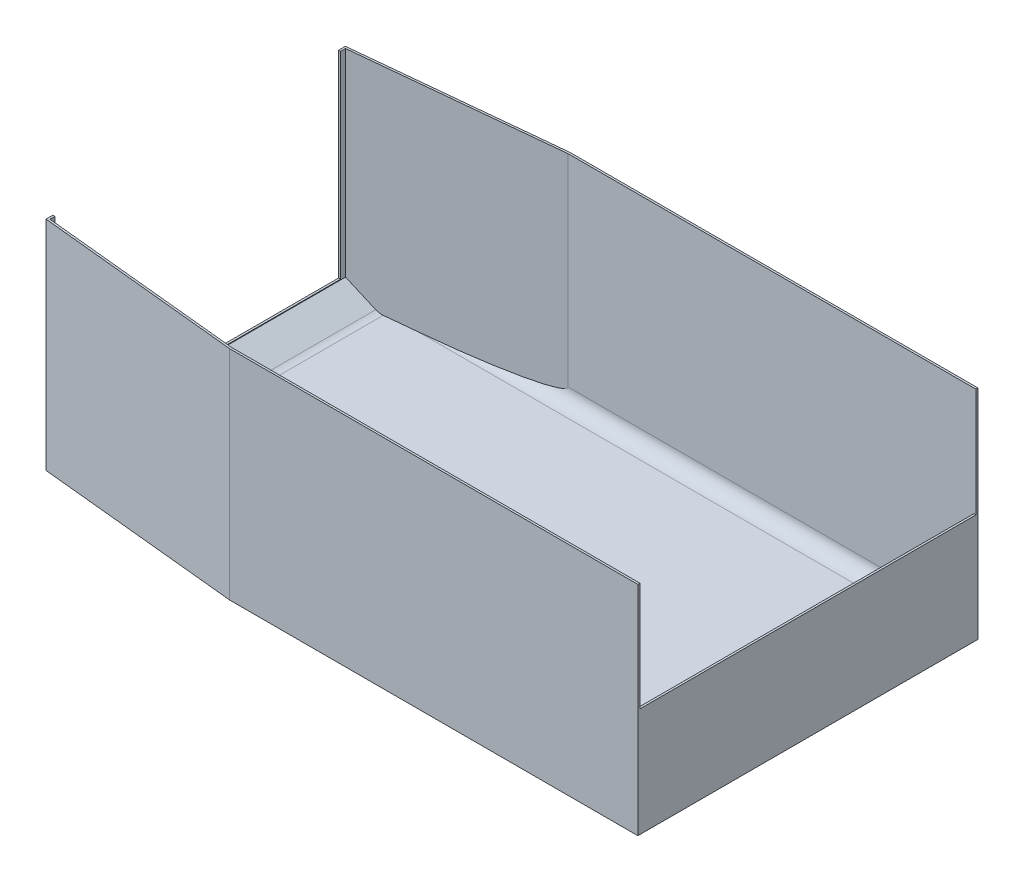
ISO-10303-21;
HEADER;
FILE_DESCRIPTION(('STEP AP214'),'2;1');
FILE_NAME('part.step','',(''),(''),'','','');
FILE_SCHEMA(('AUTOMOTIVE_DESIGN { 1 0 10303 214 1 1 1 1 }'));
ENDSEC;
DATA;
#1=APPLICATION_CONTEXT('core data for automotive mechanical design processes');
#2=APPLICATION_PROTOCOL_DEFINITION('international standard','automotive_design',2000,#1);
#3=PRODUCT_CONTEXT('',#1,'mechanical');
#4=PRODUCT('Part','Part','',(#3));
#5=PRODUCT_RELATED_PRODUCT_CATEGORY('part','',(#4));
#6=PRODUCT_DEFINITION_FORMATION('','',#4);
#7=PRODUCT_DEFINITION_CONTEXT('part definition',#1,'design');
#8=PRODUCT_DEFINITION('design','',#6,#7);
#9=PRODUCT_DEFINITION_SHAPE('','',#8);
#10=(LENGTH_UNIT() NAMED_UNIT(*) SI_UNIT(.MILLI.,.METRE.));
#11=(NAMED_UNIT(*) PLANE_ANGLE_UNIT() SI_UNIT($,.RADIAN.));
#12=(NAMED_UNIT(*) SI_UNIT($,.STERADIAN.) SOLID_ANGLE_UNIT());
#13=UNCERTAINTY_MEASURE_WITH_UNIT(LENGTH_MEASURE(1.E-05),#10,'distance_accuracy_value','');
#14=(GEOMETRIC_REPRESENTATION_CONTEXT(3) GLOBAL_UNCERTAINTY_ASSIGNED_CONTEXT((#13)) GLOBAL_UNIT_ASSIGNED_CONTEXT((#10,
#11,#12)) REPRESENTATION_CONTEXT('',''));
#15=CARTESIAN_POINT('',(0.,0.,0.));
#16=DIRECTION('',(0.,0.,1.));
#17=DIRECTION('',(1.,0.,0.));
#18=AXIS2_PLACEMENT_3D('',#15,#16,#17);
#19=CARTESIAN_POINT('',(0.,160.,0.));
#20=DIRECTION('',(0.,1.,0.));
#21=DIRECTION('',(0.,0.,1.));
#22=AXIS2_PLACEMENT_3D('',#19,#20,#21);
#23=PLANE('',#22);
#24=DIRECTION('',(0.,0.,-1.));
#25=VECTOR('',#24,1.);
#26=CARTESIAN_POINT('',(150.,160.,-125.));
#27=LINE('',#26,#25);
#28=CARTESIAN_POINT('',(150.,160.,125.));
#29=VERTEX_POINT('',#28);
#30=CARTESIAN_POINT('',(150.,160.,123.5));
#31=VERTEX_POINT('',#30);
#32=EDGE_CURVE('E272',#29,#31,#27,.T.);
#33=ORIENTED_EDGE('',*,*,#32,.T.);
#34=DIRECTION('',(1.,0.,0.));
#35=VECTOR('',#34,1.);
#36=CARTESIAN_POINT('',(-150.,160.,123.5));
#37=LINE('',#36,#35);
#38=CARTESIAN_POINT('',(-149.925186568319,160.,123.5));
#39=VERTEX_POINT('',#38);
#40=EDGE_CURVE('E206',#39,#31,#37,.T.);
#41=ORIENTED_EDGE('',*,*,#40,.F.);
#42=DIRECTION('',(0.995037190209989,0.,0.0995037190209985));
#43=VECTOR('',#42,1.);
#44=CARTESIAN_POINT('',(-299.850744421468,160.,108.507444214685));
#45=LINE('',#44,#43);
#46=CARTESIAN_POINT('',(-298.5,160.,108.642518656832));
#47=VERTEX_POINT('',#46);
#48=EDGE_CURVE('E268',#47,#39,#45,.T.);
#49=ORIENTED_EDGE('',*,*,#48,.F.);
#50=DIRECTION('',(0.,0.,1.));
#51=VECTOR('',#50,1.);
#52=CARTESIAN_POINT('',(-298.5,160.,110.));
#53=LINE('',#52,#51);
#54=CARTESIAN_POINT('',(-298.5,160.,105.));
#55=VERTEX_POINT('',#54);
#56=EDGE_CURVE('E264',#55,#47,#53,.T.);
#57=ORIENTED_EDGE('',*,*,#56,.F.);
#58=DIRECTION('',(1.,0.,0.));
#59=VECTOR('',#58,1.);
#60=CARTESIAN_POINT('',(0.,160.,105.));
#61=LINE('',#60,#59);
#62=CARTESIAN_POINT('',(-300.,160.,105.));
#63=VERTEX_POINT('',#62);
#64=EDGE_CURVE('E229',#63,#55,#61,.T.);
#65=ORIENTED_EDGE('',*,*,#64,.F.);
#66=DIRECTION('',(0.,0.,1.));
#67=VECTOR('',#66,1.);
#68=CARTESIAN_POINT('',(-300.,160.,110.));
#69=LINE('',#68,#67);
#70=CARTESIAN_POINT('',(-300.,160.,110.));
#71=VERTEX_POINT('',#70);
#72=EDGE_CURVE('E279',#63,#71,#69,.T.);
#73=ORIENTED_EDGE('',*,*,#72,.T.);
#74=DIRECTION('',(0.995037190209989,0.,0.0995037190209984));
#75=VECTOR('',#74,1.);
#76=CARTESIAN_POINT('',(-300.,160.,110.));
#77=LINE('',#76,#75);
#78=CARTESIAN_POINT('',(-150.,160.,125.));
#79=VERTEX_POINT('',#78);
#80=EDGE_CURVE('E283',#71,#79,#77,.T.);
#81=ORIENTED_EDGE('',*,*,#80,.T.);
#82=DIRECTION('',(1.,0.,0.));
#83=VECTOR('',#82,1.);
#84=CARTESIAN_POINT('',(-150.,160.,125.));
#85=LINE('',#84,#83);
#86=EDGE_CURVE('E285',#79,#29,#85,.T.);
#87=ORIENTED_EDGE('',*,*,#86,.T.);
#88=EDGE_LOOP('',(#33,#41,#49,#57,#65,#73,#81,#87));
#89=FACE_BOUND('',#88,.T.);
#90=ADVANCED_FACE('F43',(#89),#23,.T.);
#91=CARTESIAN_POINT('',(150.,160.,-125.));
#92=DIRECTION('',(-1.,0.,0.));
#93=DIRECTION('',(0.,0.,1.));
#94=AXIS2_PLACEMENT_3D('',#91,#92,#93);
#95=PLANE('',#94);
#96=DIRECTION('',(0.,0.,-1.));
#97=VECTOR('',#96,1.);
#98=CARTESIAN_POINT('',(150.,80.,123.5));
#99=LINE('',#98,#97);
#100=CARTESIAN_POINT('',(150.,80.,123.5));
#101=VERTEX_POINT('',#100);
#102=CARTESIAN_POINT('',(150.,80.,-123.5));
#103=VERTEX_POINT('',#102);
#104=EDGE_CURVE('E195',#101,#103,#99,.T.);
#105=ORIENTED_EDGE('',*,*,#104,.F.);
#106=DIRECTION('',(0.,-1.,0.));
#107=VECTOR('',#106,1.);
#108=CARTESIAN_POINT('',(150.,160.,123.5));
#109=LINE('',#108,#107);
#110=EDGE_CURVE('E203',#31,#101,#109,.T.);
#111=ORIENTED_EDGE('',*,*,#110,.F.);
#112=ORIENTED_EDGE('',*,*,#32,.F.);
#113=DIRECTION('',(0.,-1.,0.));
#114=VECTOR('',#113,1.);
#115=CARTESIAN_POINT('',(150.,160.,125.));
#116=LINE('',#115,#114);
#117=CARTESIAN_POINT('',(150.,0.,125.));
#118=VERTEX_POINT('',#117);
#119=EDGE_CURVE('E287',#29,#118,#116,.T.);
#120=ORIENTED_EDGE('',*,*,#119,.T.);
#121=DIRECTION('',(0.,0.,-1.));
#122=VECTOR('',#121,1.);
#123=CARTESIAN_POINT('',(150.,0.,-125.));
#124=LINE('',#123,#122);
#125=CARTESIAN_POINT('',(150.,0.,-125.));
#126=VERTEX_POINT('',#125);
#127=EDGE_CURVE('E242',#118,#126,#124,.T.);
#128=ORIENTED_EDGE('',*,*,#127,.T.);
#129=DIRECTION('',(0.,-1.,0.));
#130=VECTOR('',#129,1.);
#131=CARTESIAN_POINT('',(150.,160.,-125.));
#132=LINE('',#131,#130);
#133=CARTESIAN_POINT('',(150.,160.,-125.));
#134=VERTEX_POINT('',#133);
#135=EDGE_CURVE('E314',#134,#126,#132,.T.);
#136=ORIENTED_EDGE('',*,*,#135,.F.);
#137=CARTESIAN_POINT('',(150.,160.,-123.5));
#138=VERTEX_POINT('',#137);
#139=EDGE_CURVE('E275',#138,#134,#27,.T.);
#140=ORIENTED_EDGE('',*,*,#139,.F.);
#141=DIRECTION('',(0.,1.,0.));
#142=VECTOR('',#141,1.);
#143=CARTESIAN_POINT('',(150.,160.,-123.5));
#144=LINE('',#143,#142);
#145=EDGE_CURVE('E200',#103,#138,#144,.T.);
#146=ORIENTED_EDGE('',*,*,#145,.F.);
#147=EDGE_LOOP('',(#105,#111,#112,#120,#128,#136,#140,#146));
#148=FACE_BOUND('',#147,.T.);
#149=ADVANCED_FACE('F211',(#148),#95,.F.);
#150=CARTESIAN_POINT('',(-150.,160.,-125.));
#151=DIRECTION('',(0.,0.,1.));
#152=DIRECTION('',(1.,0.,0.));
#153=AXIS2_PLACEMENT_3D('',#150,#151,#152);
#154=PLANE('',#153);
#155=DIRECTION('',(-1.,0.,0.));
#156=VECTOR('',#155,1.);
#157=CARTESIAN_POINT('',(-150.,0.,-125.));
#158=LINE('',#157,#156);
#159=CARTESIAN_POINT('',(-150.,0.,-125.));
#160=VERTEX_POINT('',#159);
#161=EDGE_CURVE('E290',#126,#160,#158,.T.);
#162=ORIENTED_EDGE('',*,*,#161,.T.);
#163=DIRECTION('',(0.,-1.,0.));
#164=VECTOR('',#163,1.);
#165=CARTESIAN_POINT('',(-150.,160.,-125.));
#166=LINE('',#165,#164);
#167=CARTESIAN_POINT('',(-150.,160.,-125.));
#168=VERTEX_POINT('',#167);
#169=EDGE_CURVE('E311',#168,#160,#166,.T.);
#170=ORIENTED_EDGE('',*,*,#169,.F.);
#171=DIRECTION('',(-1.,0.,0.));
#172=VECTOR('',#171,1.);
#173=CARTESIAN_POINT('',(-150.,160.,-125.));
#174=LINE('',#173,#172);
#175=EDGE_CURVE('E274',#134,#168,#174,.T.);
#176=ORIENTED_EDGE('',*,*,#175,.F.);
#177=ORIENTED_EDGE('',*,*,#135,.T.);
#178=EDGE_LOOP('',(#162,#170,#176,#177));
#179=FACE_BOUND('',#178,.T.);
#180=ADVANCED_FACE('F406',(#179),#154,.F.);
#181=CARTESIAN_POINT('',(-300.,160.,-110.));
#182=DIRECTION('',(0.0995037190209992,0.,0.995037190209989));
#183=DIRECTION('',(0.995037190209989,0.,-0.0995037190209992));
#184=AXIS2_PLACEMENT_3D('',#181,#182,#183);
#185=PLANE('',#184);
#186=DIRECTION('',(-0.995037190209989,0.,0.0995037190209992));
#187=VECTOR('',#186,1.);
#188=CARTESIAN_POINT('',(-300.,0.,-110.));
#189=LINE('',#188,#187);
#190=CARTESIAN_POINT('',(-300.,0.,-110.));
#191=VERTEX_POINT('',#190);
#192=EDGE_CURVE('E292',#160,#191,#189,.T.);
#193=ORIENTED_EDGE('',*,*,#192,.T.);
#194=DIRECTION('',(0.,-1.,0.));
#195=VECTOR('',#194,1.);
#196=CARTESIAN_POINT('',(-300.,160.,-110.));
#197=LINE('',#196,#195);
#198=CARTESIAN_POINT('',(-300.,160.,-110.));
#199=VERTEX_POINT('',#198);
#200=EDGE_CURVE('E308',#199,#191,#197,.T.);
#201=ORIENTED_EDGE('',*,*,#200,.F.);
#202=DIRECTION('',(-0.995037190209989,0.,0.0995037190209992));
#203=VECTOR('',#202,1.);
#204=CARTESIAN_POINT('',(-300.,160.,-110.));
#205=LINE('',#204,#203);
#206=EDGE_CURVE('E277',#168,#199,#205,.T.);
#207=ORIENTED_EDGE('',*,*,#206,.F.);
#208=ORIENTED_EDGE('',*,*,#169,.T.);
#209=EDGE_LOOP('',(#193,#201,#207,#208));
#210=FACE_BOUND('',#209,.T.);
#211=ADVANCED_FACE('F431',(#210),#185,.F.);
#212=CARTESIAN_POINT('',(-300.,160.,110.));
#213=DIRECTION('',(1.,0.,0.));
#214=DIRECTION('',(0.,0.,-1.));
#215=AXIS2_PLACEMENT_3D('',#212,#213,#214);
#216=PLANE('',#215);
#217=DIRECTION('',(0.,0.,1.));
#218=VECTOR('',#217,1.);
#219=CARTESIAN_POINT('',(-300.,15.,-105.));
#220=LINE('',#219,#218);
#221=CARTESIAN_POINT('',(-300.,15.,-105.));
#222=VERTEX_POINT('',#221);
#223=CARTESIAN_POINT('',(-300.,15.,105.));
#224=VERTEX_POINT('',#223);
#225=EDGE_CURVE('E221',#222,#224,#220,.T.);
#226=ORIENTED_EDGE('',*,*,#225,.F.);
#227=DIRECTION('',(0.,-1.,0.));
#228=VECTOR('',#227,1.);
#229=CARTESIAN_POINT('',(-300.,200.,-105.));
#230=LINE('',#229,#228);
#231=CARTESIAN_POINT('',(-300.,160.,-105.));
#232=VERTEX_POINT('',#231);
#233=EDGE_CURVE('E219',#232,#222,#230,.T.);
#234=ORIENTED_EDGE('',*,*,#233,.F.);
#235=EDGE_CURVE('E280',#199,#232,#69,.T.);
#236=ORIENTED_EDGE('',*,*,#235,.F.);
#237=ORIENTED_EDGE('',*,*,#200,.T.);
#238=DIRECTION('',(0.,0.,1.));
#239=VECTOR('',#238,1.);
#240=CARTESIAN_POINT('',(-300.,0.,110.));
#241=LINE('',#240,#239);
#242=CARTESIAN_POINT('',(-300.,0.,110.));
#243=VERTEX_POINT('',#242);
#244=EDGE_CURVE('E294',#191,#243,#241,.T.);
#245=ORIENTED_EDGE('',*,*,#244,.T.);
#246=DIRECTION('',(0.,-1.,0.));
#247=VECTOR('',#246,1.);
#248=CARTESIAN_POINT('',(-300.,160.,110.));
#249=LINE('',#248,#247);
#250=EDGE_CURVE('E305',#71,#243,#249,.T.);
#251=ORIENTED_EDGE('',*,*,#250,.F.);
#252=ORIENTED_EDGE('',*,*,#72,.F.);
#253=DIRECTION('',(0.,1.,0.));
#254=VECTOR('',#253,1.);
#255=CARTESIAN_POINT('',(-300.,200.,105.));
#256=LINE('',#255,#254);
#257=EDGE_CURVE('E224',#224,#63,#256,.T.);
#258=ORIENTED_EDGE('',*,*,#257,.F.);
#259=EDGE_LOOP('',(#226,#234,#236,#237,#245,#251,#252,#258));
#260=FACE_BOUND('',#259,.T.);
#261=ADVANCED_FACE('F425',(#260),#216,.F.);
#262=CARTESIAN_POINT('',(-300.,160.,110.));
#263=DIRECTION('',(0.0995037190209985,0.,-0.995037190209989));
#264=DIRECTION('',(-0.995037190209989,0.,-0.0995037190209985));
#265=AXIS2_PLACEMENT_3D('',#262,#263,#264);
#266=PLANE('',#265);
#267=DIRECTION('',(0.995037190209989,0.,0.0995037190209984));
#268=VECTOR('',#267,1.);
#269=CARTESIAN_POINT('',(-300.,0.,110.));
#270=LINE('',#269,#268);
#271=CARTESIAN_POINT('',(-150.,0.,125.));
#272=VERTEX_POINT('',#271);
#273=EDGE_CURVE('E296',#243,#272,#270,.T.);
#274=ORIENTED_EDGE('',*,*,#273,.T.);
#275=DIRECTION('',(0.,-1.,0.));
#276=VECTOR('',#275,1.);
#277=CARTESIAN_POINT('',(-150.,160.,125.));
#278=LINE('',#277,#276);
#279=EDGE_CURVE('E302',#79,#272,#278,.T.);
#280=ORIENTED_EDGE('',*,*,#279,.F.);
#281=ORIENTED_EDGE('',*,*,#80,.F.);
#282=ORIENTED_EDGE('',*,*,#250,.T.);
#283=EDGE_LOOP('',(#274,#280,#281,#282));
#284=FACE_BOUND('',#283,.T.);
#285=ADVANCED_FACE('F419',(#284),#266,.F.);
#286=CARTESIAN_POINT('',(-150.,160.,125.));
#287=DIRECTION('',(0.,0.,-1.));
#288=DIRECTION('',(-1.,0.,0.));
#289=AXIS2_PLACEMENT_3D('',#286,#287,#288);
#290=PLANE('',#289);
#291=DIRECTION('',(1.,0.,0.));
#292=VECTOR('',#291,1.);
#293=CARTESIAN_POINT('',(-150.,0.,125.));
#294=LINE('',#293,#292);
#295=EDGE_CURVE('E298',#272,#118,#294,.T.);
#296=ORIENTED_EDGE('',*,*,#295,.T.);
#297=ORIENTED_EDGE('',*,*,#119,.F.);
#298=ORIENTED_EDGE('',*,*,#86,.F.);
#299=ORIENTED_EDGE('',*,*,#279,.T.);
#300=EDGE_LOOP('',(#296,#297,#298,#299));
#301=FACE_BOUND('',#300,.T.);
#302=ADVANCED_FACE('F412',(#301),#290,.F.);
#303=DIRECTION('',(-1.,0.,0.));
#304=VECTOR('',#303,1.);
#305=CARTESIAN_POINT('',(-150.,160.,-123.5));
#306=LINE('',#305,#304);
#307=CARTESIAN_POINT('',(-149.925186568319,160.,-123.5));
#308=VERTEX_POINT('',#307);
#309=EDGE_CURVE('E259',#138,#308,#306,.T.);
#310=ORIENTED_EDGE('',*,*,#309,.F.);
#311=ORIENTED_EDGE('',*,*,#139,.T.);
#312=ORIENTED_EDGE('',*,*,#175,.T.);
#313=ORIENTED_EDGE('',*,*,#206,.T.);
#314=ORIENTED_EDGE('',*,*,#235,.T.);
#315=DIRECTION('',(-1.,0.,0.));
#316=VECTOR('',#315,1.);
#317=CARTESIAN_POINT('',(0.,160.,-105.));
#318=LINE('',#317,#316);
#319=CARTESIAN_POINT('',(-298.5,160.,-105.));
#320=VERTEX_POINT('',#319);
#321=EDGE_CURVE('E233',#320,#232,#318,.T.);
#322=ORIENTED_EDGE('',*,*,#321,.F.);
#323=CARTESIAN_POINT('',(-298.5,160.,-108.642518656832));
#324=VERTEX_POINT('',#323);
#325=EDGE_CURVE('E265',#324,#320,#53,.T.);
#326=ORIENTED_EDGE('',*,*,#325,.F.);
#327=DIRECTION('',(-0.995037190209989,0.,0.0995037190209992));
#328=VECTOR('',#327,1.);
#329=CARTESIAN_POINT('',(-299.850744421469,160.,-108.507444214685));
#330=LINE('',#329,#328);
#331=EDGE_CURVE('E262',#308,#324,#330,.T.);
#332=ORIENTED_EDGE('',*,*,#331,.F.);
#333=EDGE_LOOP('',(#310,#311,#312,#313,#314,#322,#326,#332));
#334=FACE_BOUND('',#333,.T.);
#335=ADVANCED_FACE('F371',(#334),#23,.T.);
#336=CARTESIAN_POINT('',(0.,0.,0.));
#337=DIRECTION('',(0.,1.,0.));
#338=DIRECTION('',(0.,0.,1.));
#339=AXIS2_PLACEMENT_3D('',#336,#337,#338);
#340=PLANE('',#339);
#341=ORIENTED_EDGE('',*,*,#127,.F.);
#342=ORIENTED_EDGE('',*,*,#295,.F.);
#343=ORIENTED_EDGE('',*,*,#273,.F.);
#344=ORIENTED_EDGE('',*,*,#244,.F.);
#345=ORIENTED_EDGE('',*,*,#192,.F.);
#346=ORIENTED_EDGE('',*,*,#161,.F.);
#347=EDGE_LOOP('',(#341,#342,#343,#344,#345,#346));
#348=FACE_BOUND('',#347,.T.);
#349=ADVANCED_FACE('F411',(#348),#340,.F.);
#350=CARTESIAN_POINT('',(148.5,160.,-125.));
#351=DIRECTION('',(-1.,0.,0.));
#352=DIRECTION('',(0.,0.,1.));
#353=AXIS2_PLACEMENT_3D('',#350,#351,#352);
#354=PLANE('',#353);
#355=DIRECTION('',(0.,-1.,0.));
#356=VECTOR('',#355,1.);
#357=CARTESIAN_POINT('',(148.5,160.,-123.5));
#358=LINE('',#357,#356);
#359=CARTESIAN_POINT('',(148.5,80.,-123.5));
#360=VERTEX_POINT('',#359);
#361=CARTESIAN_POINT('',(148.5,11.5,-123.5));
#362=VERTEX_POINT('',#361);
#363=EDGE_CURVE('E239',#360,#362,#358,.T.);
#364=ORIENTED_EDGE('',*,*,#363,.T.);
#365=CARTESIAN_POINT('',(148.5,11.5,-113.5));
#366=DIRECTION('',(-1.,0.,0.));
#367=DIRECTION('',(0.,0.,1.));
#368=AXIS2_PLACEMENT_3D('',#365,#366,#367);
#369=CIRCLE('',#368,10.);
#370=CARTESIAN_POINT('',(148.5,1.5,-113.5));
#371=VERTEX_POINT('',#370);
#372=EDGE_CURVE('E352',#362,#371,#369,.T.);
#373=ORIENTED_EDGE('',*,*,#372,.T.);
#374=DIRECTION('',(0.,0.,-1.));
#375=VECTOR('',#374,1.);
#376=CARTESIAN_POINT('',(148.5,1.5,-125.));
#377=LINE('',#376,#375);
#378=CARTESIAN_POINT('',(148.5,1.5,113.5));
#379=VERTEX_POINT('',#378);
#380=EDGE_CURVE('E235',#379,#371,#377,.T.);
#381=ORIENTED_EDGE('',*,*,#380,.F.);
#382=CARTESIAN_POINT('',(148.5,11.5,113.5));
#383=DIRECTION('',(-1.,0.,0.));
#384=DIRECTION('',(0.,0.,1.));
#385=AXIS2_PLACEMENT_3D('',#382,#383,#384);
#386=CIRCLE('',#385,10.);
#387=CARTESIAN_POINT('',(148.5,11.5,123.5));
#388=VERTEX_POINT('',#387);
#389=EDGE_CURVE('E65',#379,#388,#386,.T.);
#390=ORIENTED_EDGE('',*,*,#389,.T.);
#391=DIRECTION('',(0.,-1.,0.));
#392=VECTOR('',#391,1.);
#393=CARTESIAN_POINT('',(148.5,160.,123.5));
#394=LINE('',#393,#392);
#395=CARTESIAN_POINT('',(148.5,80.,123.5));
#396=VERTEX_POINT('',#395);
#397=EDGE_CURVE('E244',#396,#388,#394,.T.);
#398=ORIENTED_EDGE('',*,*,#397,.F.);
#399=DIRECTION('',(0.,0.,1.));
#400=VECTOR('',#399,1.);
#401=CARTESIAN_POINT('',(148.5,80.,-125.));
#402=LINE('',#401,#400);
#403=EDGE_CURVE('E198',#360,#396,#402,.T.);
#404=ORIENTED_EDGE('',*,*,#403,.F.);
#405=EDGE_LOOP('',(#364,#373,#381,#390,#398,#404));
#406=FACE_BOUND('',#405,.T.);
#407=ADVANCED_FACE('F354',(#406),#354,.T.);
#408=CARTESIAN_POINT('',(-150.,160.,-123.5));
#409=DIRECTION('',(0.,0.,1.));
#410=DIRECTION('',(1.,0.,0.));
#411=AXIS2_PLACEMENT_3D('',#408,#409,#410);
#412=PLANE('',#411);
#413=DIRECTION('',(0.,-1.,0.));
#414=VECTOR('',#413,1.);
#415=CARTESIAN_POINT('',(-149.925186568319,160.,-123.5));
#416=LINE('',#415,#414);
#417=CARTESIAN_POINT('',(-149.925186568319,11.5,-123.5));
#418=VERTEX_POINT('',#417);
#419=EDGE_CURVE('E243',#308,#418,#416,.T.);
#420=ORIENTED_EDGE('',*,*,#419,.T.);
#421=DIRECTION('',(-1.,0.,0.));
#422=VECTOR('',#421,1.);
#423=CARTESIAN_POINT('',(148.5,11.5,-123.5));
#424=LINE('',#423,#422);
#425=EDGE_CURVE('E349',#418,#362,#424,.F.);
#426=ORIENTED_EDGE('',*,*,#425,.T.);
#427=ORIENTED_EDGE('',*,*,#363,.F.);
#428=DIRECTION('',(1.,0.,0.));
#429=VECTOR('',#428,1.);
#430=CARTESIAN_POINT('',(-50.,80.,-123.5));
#431=LINE('',#430,#429);
#432=EDGE_CURVE('E199',#360,#103,#431,.T.);
#433=ORIENTED_EDGE('',*,*,#432,.T.);
#434=ORIENTED_EDGE('',*,*,#145,.T.);
#435=ORIENTED_EDGE('',*,*,#309,.T.);
#436=EDGE_LOOP('',(#420,#426,#427,#433,#434,#435));
#437=FACE_BOUND('',#436,.T.);
#438=ADVANCED_FACE('F369',(#437),#412,.T.);
#439=CARTESIAN_POINT('',(-299.850744421469,160.,-108.507444214685));
#440=DIRECTION('',(0.0995037190209992,0.,0.995037190209989));
#441=DIRECTION('',(0.995037190209989,0.,-0.0995037190209992));
#442=AXIS2_PLACEMENT_3D('',#439,#440,#441);
#443=PLANE('',#442);
#444=DIRECTION('',(-0.995037190209989,0.,0.0995037190209992));
#445=VECTOR('',#444,1.);
#446=CARTESIAN_POINT('',(-299.850744421469,1.5,-108.507444214685));
#447=LINE('',#446,#445);
#448=CARTESIAN_POINT('',(-249.925186568318,1.5,-113.5));
#449=VERTEX_POINT('',#448);
#450=CARTESIAN_POINT('',(-273.303847577293,1.5,-111.162133899102));
#451=VERTEX_POINT('',#450);
#452=EDGE_CURVE('E238',#449,#451,#447,.T.);
#453=ORIENTED_EDGE('',*,*,#452,.F.);
#454=CARTESIAN_POINT('',(-249.925186568318,11.5,-113.5));
#455=DIRECTION('',(0.0995037190209992,0.,0.995037190209989));
#456=DIRECTION('',(0.995037190209989,0.,-0.0995037190209992));
#457=AXIS2_PLACEMENT_3D('',#454,#455,#456);
#458=ELLIPSE('',#457,100.498756211209,10.);
#459=EDGE_CURVE('E347',#449,#418,#458,.T.);
#460=ORIENTED_EDGE('',*,*,#459,.T.);
#461=ORIENTED_EDGE('',*,*,#419,.F.);
#462=ORIENTED_EDGE('',*,*,#331,.T.);
#463=DIRECTION('',(0.,-1.,0.));
#464=VECTOR('',#463,1.);
#465=CARTESIAN_POINT('',(-298.5,160.,-108.642518656832));
#466=LINE('',#465,#464);
#467=CARTESIAN_POINT('',(-298.5,14.5,-108.642518656832));
#468=VERTEX_POINT('',#467);
#469=EDGE_CURVE('E249',#324,#468,#466,.T.);
#470=ORIENTED_EDGE('',*,*,#469,.T.);
#471=DIRECTION('',(-0.86279596281458,0.498135481386712,0.0862795962814582));
#472=VECTOR('',#471,1.);
#473=CARTESIAN_POINT('',(-362.049912679484,51.1905591924765,-102.287527388883));
#474=LINE('',#473,#472);
#475=CARTESIAN_POINT('',(-278.303847577293,2.83974596215562,-110.662133899102));
#476=VERTEX_POINT('',#475);
#477=EDGE_CURVE('E328',#468,#476,#474,.F.);
#478=ORIENTED_EDGE('',*,*,#477,.T.);
#479=CARTESIAN_POINT('',(-273.303847577293,11.5,-111.162133899102));
#480=DIRECTION('',(0.0995037190209992,0.,0.995037190209989));
#481=DIRECTION('',(0.995037190209989,0.,-0.0995037190209992));
#482=AXIS2_PLACEMENT_3D('',#479,#480,#481);
#483=ELLIPSE('',#482,10.0498756211209,10.);
#484=EDGE_CURVE('E338',#476,#451,#483,.T.);
#485=ORIENTED_EDGE('',*,*,#484,.T.);
#486=EDGE_LOOP('',(#453,#460,#461,#462,#470,#478,#485));
#487=FACE_BOUND('',#486,.T.);
#488=ADVANCED_FACE('F366',(#487),#443,.T.);
#489=CARTESIAN_POINT('',(-298.5,160.,110.));
#490=DIRECTION('',(1.,0.,0.));
#491=DIRECTION('',(0.,0.,-1.));
#492=AXIS2_PLACEMENT_3D('',#489,#490,#491);
#493=PLANE('',#492);
#494=DIRECTION('',(0.,-1.,0.));
#495=VECTOR('',#494,1.);
#496=CARTESIAN_POINT('',(-298.5,160.,108.642518656832));
#497=LINE('',#496,#495);
#498=CARTESIAN_POINT('',(-298.5,14.5,108.642518656832));
#499=VERTEX_POINT('',#498);
#500=EDGE_CURVE('E254',#47,#499,#497,.T.);
#501=ORIENTED_EDGE('',*,*,#500,.T.);
#502=DIRECTION('',(0.,0.,-1.));
#503=VECTOR('',#502,1.);
#504=CARTESIAN_POINT('',(-298.5,14.5,-108.642518656832));
#505=LINE('',#504,#503);
#506=EDGE_CURVE('E326',#499,#468,#505,.T.);
#507=ORIENTED_EDGE('',*,*,#506,.T.);
#508=ORIENTED_EDGE('',*,*,#469,.F.);
#509=ORIENTED_EDGE('',*,*,#325,.T.);
#510=DIRECTION('',(0.,1.,0.));
#511=VECTOR('',#510,1.);
#512=CARTESIAN_POINT('',(-298.5,160.,-105.));
#513=LINE('',#512,#511);
#514=CARTESIAN_POINT('',(-298.5,15.,-105.));
#515=VERTEX_POINT('',#514);
#516=EDGE_CURVE('E322',#515,#320,#513,.T.);
#517=ORIENTED_EDGE('',*,*,#516,.F.);
#518=DIRECTION('',(0.,0.,-1.));
#519=VECTOR('',#518,1.);
#520=CARTESIAN_POINT('',(-298.5,15.,110.));
#521=LINE('',#520,#519);
#522=CARTESIAN_POINT('',(-298.5,15.,105.));
#523=VERTEX_POINT('',#522);
#524=EDGE_CURVE('E317',#523,#515,#521,.T.);
#525=ORIENTED_EDGE('',*,*,#524,.F.);
#526=DIRECTION('',(0.,-1.,0.));
#527=VECTOR('',#526,1.);
#528=CARTESIAN_POINT('',(-298.5,160.,105.));
#529=LINE('',#528,#527);
#530=EDGE_CURVE('E319',#55,#523,#529,.T.);
#531=ORIENTED_EDGE('',*,*,#530,.F.);
#532=ORIENTED_EDGE('',*,*,#56,.T.);
#533=EDGE_LOOP('',(#501,#507,#508,#509,#517,#525,#531,#532));
#534=FACE_BOUND('',#533,.T.);
#535=ADVANCED_FACE('F378',(#534),#493,.T.);
#536=CARTESIAN_POINT('',(-299.850744421468,160.,108.507444214685));
#537=DIRECTION('',(0.0995037190209985,0.,-0.995037190209989));
#538=DIRECTION('',(-0.995037190209989,0.,-0.0995037190209985));
#539=AXIS2_PLACEMENT_3D('',#536,#537,#538);
#540=PLANE('',#539);
#541=DIRECTION('',(0.,-1.,0.));
#542=VECTOR('',#541,1.);
#543=CARTESIAN_POINT('',(-149.925186568319,160.,123.5));
#544=LINE('',#543,#542);
#545=CARTESIAN_POINT('',(-149.925186568319,11.5,123.5));
#546=VERTEX_POINT('',#545);
#547=EDGE_CURVE('E246',#39,#546,#544,.T.);
#548=ORIENTED_EDGE('',*,*,#547,.T.);
#549=CARTESIAN_POINT('',(-249.925186568319,11.5,113.5));
#550=DIRECTION('',(0.0995037190209985,0.,-0.995037190209989));
#551=DIRECTION('',(-0.995037190209989,0.,-0.0995037190209985));
#552=AXIS2_PLACEMENT_3D('',#549,#550,#551);
#553=ELLIPSE('',#552,100.498756211209,10.);
#554=CARTESIAN_POINT('',(-249.925186568319,1.5,113.5));
#555=VERTEX_POINT('',#554);
#556=EDGE_CURVE('E11',#546,#555,#553,.T.);
#557=ORIENTED_EDGE('',*,*,#556,.T.);
#558=DIRECTION('',(0.995037190209989,0.,0.0995037190209985));
#559=VECTOR('',#558,1.);
#560=CARTESIAN_POINT('',(-299.850744421468,1.5,108.507444214685));
#561=LINE('',#560,#559);
#562=CARTESIAN_POINT('',(-273.303847577293,1.5,111.162133899103));
#563=VERTEX_POINT('',#562);
#564=EDGE_CURVE('E251',#563,#555,#561,.T.);
#565=ORIENTED_EDGE('',*,*,#564,.F.);
#566=CARTESIAN_POINT('',(-273.303847577293,11.5,111.162133899103));
#567=DIRECTION('',(0.0995037190209985,0.,-0.995037190209989));
#568=DIRECTION('',(-0.995037190209989,0.,-0.0995037190209985));
#569=AXIS2_PLACEMENT_3D('',#566,#567,#568);
#570=ELLIPSE('',#569,10.0498756211209,10.);
#571=CARTESIAN_POINT('',(-278.303847577293,2.83974596215562,110.662133899103));
#572=VERTEX_POINT('',#571);
#573=EDGE_CURVE('E334',#563,#572,#570,.T.);
#574=ORIENTED_EDGE('',*,*,#573,.T.);
#575=DIRECTION('',(0.86279596281458,-0.498135481386712,0.0862795962814576));
#576=VECTOR('',#575,1.);
#577=CARTESIAN_POINT('',(-362.049912679484,51.1905591924764,102.287527388884));
#578=LINE('',#577,#576);
#579=EDGE_CURVE('E324',#572,#499,#578,.F.);
#580=ORIENTED_EDGE('',*,*,#579,.T.);
#581=ORIENTED_EDGE('',*,*,#500,.F.);
#582=ORIENTED_EDGE('',*,*,#48,.T.);
#583=EDGE_LOOP('',(#548,#557,#565,#574,#580,#581,#582));
#584=FACE_BOUND('',#583,.T.);
#585=ADVANCED_FACE('F392',(#584),#540,.T.);
#586=CARTESIAN_POINT('',(-150.,160.,123.5));
#587=DIRECTION('',(0.,0.,-1.));
#588=DIRECTION('',(-1.,0.,0.));
#589=AXIS2_PLACEMENT_3D('',#586,#587,#588);
#590=PLANE('',#589);
#591=ORIENTED_EDGE('',*,*,#397,.T.);
#592=DIRECTION('',(1.,0.,0.));
#593=VECTOR('',#592,1.);
#594=CARTESIAN_POINT('',(-149.925186568319,11.5,123.5));
#595=LINE('',#594,#593);
#596=EDGE_CURVE('E51',#388,#546,#595,.F.);
#597=ORIENTED_EDGE('',*,*,#596,.T.);
#598=ORIENTED_EDGE('',*,*,#547,.F.);
#599=ORIENTED_EDGE('',*,*,#40,.T.);
#600=ORIENTED_EDGE('',*,*,#110,.T.);
#601=DIRECTION('',(1.,0.,0.));
#602=VECTOR('',#601,1.);
#603=CARTESIAN_POINT('',(-50.,80.,123.5));
#604=LINE('',#603,#602);
#605=EDGE_CURVE('E191',#396,#101,#604,.T.);
#606=ORIENTED_EDGE('',*,*,#605,.F.);
#607=EDGE_LOOP('',(#591,#597,#598,#599,#600,#606));
#608=FACE_BOUND('',#607,.T.);
#609=ADVANCED_FACE('F204',(#608),#590,.T.);
#610=CARTESIAN_POINT('',(0.,1.5,0.));
#611=DIRECTION('',(0.,1.,0.));
#612=DIRECTION('',(0.,0.,1.));
#613=AXIS2_PLACEMENT_3D('',#610,#611,#612);
#614=PLANE('',#613);
#615=ORIENTED_EDGE('',*,*,#380,.T.);
#616=DIRECTION('',(-1.,0.,0.));
#617=VECTOR('',#616,1.);
#618=CARTESIAN_POINT('',(-149.925186568319,1.5,-113.5));
#619=LINE('',#618,#617);
#620=EDGE_CURVE('E344',#371,#449,#619,.T.);
#621=ORIENTED_EDGE('',*,*,#620,.T.);
#622=ORIENTED_EDGE('',*,*,#452,.T.);
#623=DIRECTION('',(0.,0.,-1.));
#624=VECTOR('',#623,1.);
#625=CARTESIAN_POINT('',(-273.303847577293,1.5,0.));
#626=LINE('',#625,#624);
#627=EDGE_CURVE('E331',#451,#563,#626,.F.);
#628=ORIENTED_EDGE('',*,*,#627,.T.);
#629=ORIENTED_EDGE('',*,*,#564,.T.);
#630=DIRECTION('',(1.,0.,0.));
#631=VECTOR('',#630,1.);
#632=CARTESIAN_POINT('',(148.5,1.5,113.5));
#633=LINE('',#632,#631);
#634=EDGE_CURVE('E341',#555,#379,#633,.T.);
#635=ORIENTED_EDGE('',*,*,#634,.T.);
#636=EDGE_LOOP('',(#615,#621,#622,#628,#629,#635));
#637=FACE_BOUND('',#636,.T.);
#638=ADVANCED_FACE('F360',(#637),#614,.T.);
#639=CARTESIAN_POINT('',(-100.,200.,-105.));
#640=DIRECTION('',(0.,0.,-1.));
#641=DIRECTION('',(-1.,0.,0.));
#642=AXIS2_PLACEMENT_3D('',#639,#640,#641);
#643=PLANE('',#642);
#644=ORIENTED_EDGE('',*,*,#321,.T.);
#645=ORIENTED_EDGE('',*,*,#233,.T.);
#646=DIRECTION('',(-1.,0.,0.));
#647=VECTOR('',#646,1.);
#648=CARTESIAN_POINT('',(-100.,15.,-105.));
#649=LINE('',#648,#647);
#650=EDGE_CURVE('E226',#515,#222,#649,.T.);
#651=ORIENTED_EDGE('',*,*,#650,.F.);
#652=ORIENTED_EDGE('',*,*,#516,.T.);
#653=EDGE_LOOP('',(#644,#645,#651,#652));
#654=FACE_BOUND('',#653,.T.);
#655=ADVANCED_FACE('F456',(#654),#643,.F.);
#656=CARTESIAN_POINT('',(-100.,200.,105.));
#657=DIRECTION('',(0.,0.,1.));
#658=DIRECTION('',(1.,0.,0.));
#659=AXIS2_PLACEMENT_3D('',#656,#657,#658);
#660=PLANE('',#659);
#661=ORIENTED_EDGE('',*,*,#64,.T.);
#662=ORIENTED_EDGE('',*,*,#530,.T.);
#663=DIRECTION('',(-1.,0.,0.));
#664=VECTOR('',#663,1.);
#665=CARTESIAN_POINT('',(-100.,15.,105.));
#666=LINE('',#665,#664);
#667=EDGE_CURVE('E227',#523,#224,#666,.T.);
#668=ORIENTED_EDGE('',*,*,#667,.T.);
#669=ORIENTED_EDGE('',*,*,#257,.T.);
#670=EDGE_LOOP('',(#661,#662,#668,#669));
#671=FACE_BOUND('',#670,.T.);
#672=ADVANCED_FACE('F453',(#671),#660,.F.);
#673=CARTESIAN_POINT('',(-100.,15.,-105.));
#674=DIRECTION('',(0.,-1.,0.));
#675=DIRECTION('',(0.,0.,-1.));
#676=AXIS2_PLACEMENT_3D('',#673,#674,#675);
#677=PLANE('',#676);
#678=ORIENTED_EDGE('',*,*,#524,.T.);
#679=ORIENTED_EDGE('',*,*,#650,.T.);
#680=ORIENTED_EDGE('',*,*,#225,.T.);
#681=ORIENTED_EDGE('',*,*,#667,.F.);
#682=EDGE_LOOP('',(#678,#679,#680,#681));
#683=FACE_BOUND('',#682,.T.);
#684=ADVANCED_FACE('F444',(#683),#677,.F.);
#685=CARTESIAN_POINT('',(-275.983339501604,1.5,0.));
#686=DIRECTION('',(0.499999999999994,0.866025403784442,0.));
#687=DIRECTION('',(0.,0.,-1.));
#688=AXIS2_PLACEMENT_3D('',#685,#686,#687);
#689=PLANE('',#688);
#690=ORIENTED_EDGE('',*,*,#579,.F.);
#691=DIRECTION('',(0.,0.,1.));
#692=VECTOR('',#691,1.);
#693=CARTESIAN_POINT('',(-278.303847577293,2.83974596215561,0.));
#694=LINE('',#693,#692);
#695=EDGE_CURVE('E336',#572,#476,#694,.F.);
#696=ORIENTED_EDGE('',*,*,#695,.T.);
#697=ORIENTED_EDGE('',*,*,#477,.F.);
#698=ORIENTED_EDGE('',*,*,#506,.F.);
#699=EDGE_LOOP('',(#690,#696,#697,#698));
#700=FACE_BOUND('',#699,.T.);
#701=ADVANCED_FACE('F384',(#700),#689,.T.);
#702=CARTESIAN_POINT('',(-50.,80.,123.5));
#703=DIRECTION('',(0.,-1.,0.));
#704=DIRECTION('',(0.,0.,-1.));
#705=AXIS2_PLACEMENT_3D('',#702,#703,#704);
#706=PLANE('',#705);
#707=ORIENTED_EDGE('',*,*,#403,.T.);
#708=ORIENTED_EDGE('',*,*,#605,.T.);
#709=ORIENTED_EDGE('',*,*,#104,.T.);
#710=ORIENTED_EDGE('',*,*,#432,.F.);
#711=EDGE_LOOP('',(#707,#708,#709,#710));
#712=FACE_BOUND('',#711,.T.);
#713=ADVANCED_FACE('F193',(#712),#706,.F.);
#714=CARTESIAN_POINT('',(-273.303847577293,11.5,0.));
#715=DIRECTION('',(0.,0.,-1.));
#716=DIRECTION('',(-1.,0.,0.));
#717=AXIS2_PLACEMENT_3D('',#714,#715,#716);
#718=CYLINDRICAL_SURFACE('',#717,10.);
#719=ORIENTED_EDGE('',*,*,#484,.F.);
#720=ORIENTED_EDGE('',*,*,#695,.F.);
#721=ORIENTED_EDGE('',*,*,#573,.F.);
#722=ORIENTED_EDGE('',*,*,#627,.F.);
#723=EDGE_LOOP('',(#719,#720,#721,#722));
#724=FACE_BOUND('',#723,.T.);
#725=ADVANCED_FACE('F389',(#724),#718,.F.);
#726=CARTESIAN_POINT('',(0.,11.5,-113.5));
#727=DIRECTION('',(1.,0.,0.));
#728=DIRECTION('',(0.,0.,-1.));
#729=AXIS2_PLACEMENT_3D('',#726,#727,#728);
#730=CYLINDRICAL_SURFACE('',#729,10.);
#731=ORIENTED_EDGE('',*,*,#372,.F.);
#732=ORIENTED_EDGE('',*,*,#425,.F.);
#733=ORIENTED_EDGE('',*,*,#459,.F.);
#734=ORIENTED_EDGE('',*,*,#620,.F.);
#735=EDGE_LOOP('',(#731,#732,#733,#734));
#736=FACE_BOUND('',#735,.T.);
#737=ADVANCED_FACE('F363',(#736),#730,.F.);
#738=CARTESIAN_POINT('',(0.,11.5,113.5));
#739=DIRECTION('',(-1.,0.,0.));
#740=DIRECTION('',(0.,0.,1.));
#741=AXIS2_PLACEMENT_3D('',#738,#739,#740);
#742=CYLINDRICAL_SURFACE('',#741,10.);
#743=ORIENTED_EDGE('',*,*,#556,.F.);
#744=ORIENTED_EDGE('',*,*,#596,.F.);
#745=ORIENTED_EDGE('',*,*,#389,.F.);
#746=ORIENTED_EDGE('',*,*,#634,.F.);
#747=EDGE_LOOP('',(#743,#744,#745,#746));
#748=FACE_BOUND('',#747,.T.);
#749=ADVANCED_FACE('F45',(#748),#742,.F.);
#750=CLOSED_SHELL('',(#90,#149,#180,#211,#261,#285,#302,#335,#349,#407,#438,#488,#535,#585,#609,
#638,#655,#672,#684,#701,#713,#725,#737,#749));
#751=MANIFOLD_SOLID_BREP('B2',#750);
#752=ADVANCED_BREP_SHAPE_REPRESENTATION('',(#18,#751),#14);
#753=SHAPE_DEFINITION_REPRESENTATION(#9,#752);
ENDSEC;
END-ISO-10303-21;
